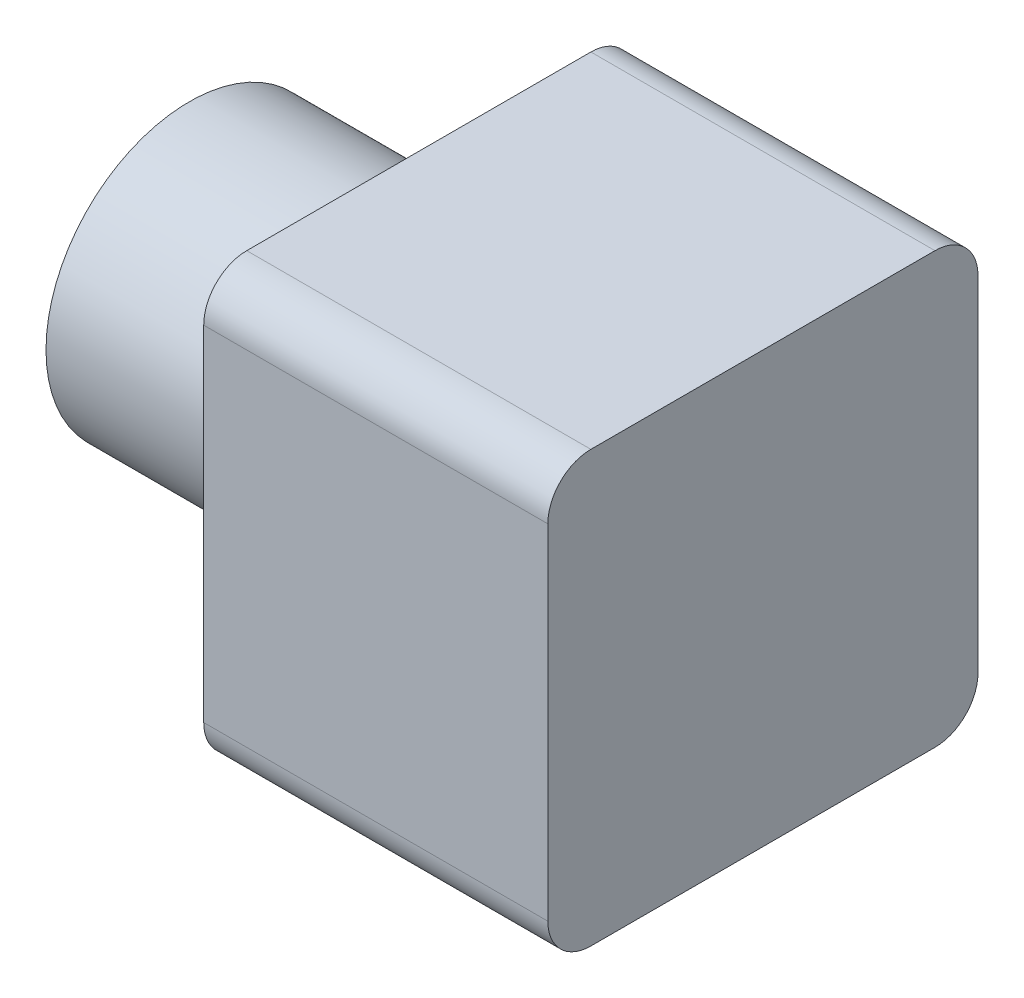
ISO-10303-21;
HEADER;
FILE_DESCRIPTION(('STEP AP214'),'2;1');
FILE_NAME('part.step','',(''),(''),'','','');
FILE_SCHEMA(('AUTOMOTIVE_DESIGN { 1 0 10303 214 1 1 1 1 }'));
ENDSEC;
DATA;
#1=APPLICATION_CONTEXT('core data for automotive mechanical design processes');
#2=APPLICATION_PROTOCOL_DEFINITION('international standard','automotive_design',2000,#1);
#3=PRODUCT_CONTEXT('',#1,'mechanical');
#4=PRODUCT('Part','Part','',(#3));
#5=PRODUCT_RELATED_PRODUCT_CATEGORY('part','',(#4));
#6=PRODUCT_DEFINITION_FORMATION('','',#4);
#7=PRODUCT_DEFINITION_CONTEXT('part definition',#1,'design');
#8=PRODUCT_DEFINITION('design','',#6,#7);
#9=PRODUCT_DEFINITION_SHAPE('','',#8);
#10=(LENGTH_UNIT() NAMED_UNIT(*) SI_UNIT(.MILLI.,.METRE.));
#11=(NAMED_UNIT(*) PLANE_ANGLE_UNIT() SI_UNIT($,.RADIAN.));
#12=(NAMED_UNIT(*) SI_UNIT($,.STERADIAN.) SOLID_ANGLE_UNIT());
#13=UNCERTAINTY_MEASURE_WITH_UNIT(LENGTH_MEASURE(1.E-05),#10,'distance_accuracy_value','');
#14=(GEOMETRIC_REPRESENTATION_CONTEXT(3) GLOBAL_UNCERTAINTY_ASSIGNED_CONTEXT((#13)) GLOBAL_UNIT_ASSIGNED_CONTEXT((#10,
#11,#12)) REPRESENTATION_CONTEXT('',''));
#15=CARTESIAN_POINT('',(0.,0.,0.));
#16=DIRECTION('',(0.,0.,1.));
#17=DIRECTION('',(1.,0.,0.));
#18=AXIS2_PLACEMENT_3D('',#15,#16,#17);
#19=CARTESIAN_POINT('',(-44.1378295770701,-31.6005777705285,-25.0000000000001));
#20=DIRECTION('',(1.,0.,0.));
#21=DIRECTION('',(0.,0.,-1.));
#22=AXIS2_PLACEMENT_3D('',#19,#20,#21);
#23=CYLINDRICAL_SURFACE('',#22,5.);
#24=CARTESIAN_POINT('',(-44.1378295770701,-31.6005777705285,-25.0000000000001));
#25=DIRECTION('',(-1.,0.,0.));
#26=DIRECTION('',(0.,0.,1.));
#27=AXIS2_PLACEMENT_3D('',#24,#25,#26);
#28=CIRCLE('',#27,5.);
#29=CARTESIAN_POINT('',(-44.1378295770701,-31.6005777705285,-20.0000000000001));
#30=VERTEX_POINT('',#29);
#31=EDGE_CURVE('E136',#30,#30,#28,.T.);
#32=ORIENTED_EDGE('',*,*,#31,.F.);
#33=EDGE_LOOP('',(#32));
#34=FACE_BOUND('',#33,.T.);
#35=CARTESIAN_POINT('',(-36.1378295770701,-31.6005777705285,-25.0000000000001));
#36=DIRECTION('',(-1.,0.,0.));
#37=DIRECTION('',(0.,0.,1.));
#38=AXIS2_PLACEMENT_3D('',#35,#36,#37);
#39=CIRCLE('',#38,5.);
#40=CARTESIAN_POINT('',(-36.1378295770701,-31.6005777705285,-20.0000000000001));
#41=VERTEX_POINT('',#40);
#42=EDGE_CURVE('E139',#41,#41,#39,.T.);
#43=ORIENTED_EDGE('',*,*,#42,.T.);
#44=EDGE_LOOP('',(#43));
#45=FACE_BOUND('',#44,.T.);
#46=ADVANCED_FACE('F32',(#34,#45),#23,.T.);
#47=CARTESIAN_POINT('',(-44.1378295770701,-31.6005777705285,-25.0000000000001));
#48=DIRECTION('',(-1.,0.,0.));
#49=DIRECTION('',(0.,0.,1.));
#50=AXIS2_PLACEMENT_3D('',#47,#48,#49);
#51=PLANE('',#50);
#52=CARTESIAN_POINT('',(-44.1378295770701,-31.6005777705285,-25.0000000000001));
#53=DIRECTION('',(-1.,0.,0.));
#54=DIRECTION('',(0.,0.,1.));
#55=AXIS2_PLACEMENT_3D('',#52,#53,#54);
#56=CIRCLE('',#55,3.99999999999999);
#57=CARTESIAN_POINT('',(-44.1378295770701,-31.6005777705285,-21.0000000000001));
#58=VERTEX_POINT('',#57);
#59=EDGE_CURVE('E181',#58,#58,#56,.T.);
#60=ORIENTED_EDGE('',*,*,#59,.F.);
#61=EDGE_LOOP('',(#60));
#62=FACE_BOUND('',#61,.T.);
#63=ORIENTED_EDGE('',*,*,#31,.T.);
#64=EDGE_LOOP('',(#63));
#65=FACE_BOUND('',#64,.T.);
#66=ADVANCED_FACE('F195',(#62,#65),#51,.T.);
#67=CARTESIAN_POINT('',(-24.1378295770701,-24.1005777705285,-17.5));
#68=DIRECTION('',(0.,0.,-1.));
#69=DIRECTION('',(-1.,0.,0.));
#70=AXIS2_PLACEMENT_3D('',#67,#68,#69);
#71=PLANE('',#70);
#72=DIRECTION('',(0.,-1.,0.));
#73=VECTOR('',#72,1.);
#74=CARTESIAN_POINT('',(-36.1378295770701,-24.1005777705285,-17.5000000000001));
#75=LINE('',#74,#73);
#76=CARTESIAN_POINT('',(-36.1378295770701,-25.6005777705285,-17.5000000000001));
#77=VERTEX_POINT('',#76);
#78=CARTESIAN_POINT('',(-36.1378295770701,-37.6005777705285,-17.5000000000001));
#79=VERTEX_POINT('',#78);
#80=EDGE_CURVE('E125',#77,#79,#75,.T.);
#81=ORIENTED_EDGE('',*,*,#80,.T.);
#82=DIRECTION('',(-1.,0.,0.));
#83=VECTOR('',#82,1.);
#84=CARTESIAN_POINT('',(-24.1378295770701,-37.6005777705285,-17.5000000000001));
#85=LINE('',#84,#83);
#86=CARTESIAN_POINT('',(-24.1378295770701,-37.6005777705285,-17.5000000000001));
#87=VERTEX_POINT('',#86);
#88=EDGE_CURVE('E103',#79,#87,#85,.F.);
#89=ORIENTED_EDGE('',*,*,#88,.T.);
#90=DIRECTION('',(0.,-1.,0.));
#91=VECTOR('',#90,1.);
#92=CARTESIAN_POINT('',(-24.1378295770701,-24.1005777705285,-17.5));
#93=LINE('',#92,#91);
#94=CARTESIAN_POINT('',(-24.1378295770701,-25.6005777705285,-17.5));
#95=VERTEX_POINT('',#94);
#96=EDGE_CURVE('E135',#95,#87,#93,.T.);
#97=ORIENTED_EDGE('',*,*,#96,.F.);
#98=DIRECTION('',(-1.,0.,0.));
#99=VECTOR('',#98,1.);
#100=CARTESIAN_POINT('',(-24.1378295770701,-25.6005777705285,-17.5));
#101=LINE('',#100,#99);
#102=EDGE_CURVE('E108',#95,#77,#101,.T.);
#103=ORIENTED_EDGE('',*,*,#102,.T.);
#104=EDGE_LOOP('',(#81,#89,#97,#103));
#105=FACE_BOUND('',#104,.T.);
#106=ADVANCED_FACE('F198',(#105),#71,.F.);
#107=CARTESIAN_POINT('',(-24.1378295770701,-39.1005777705285,-17.5000000000001));
#108=DIRECTION('',(0.,1.,0.));
#109=DIRECTION('',(-1.,0.,0.));
#110=AXIS2_PLACEMENT_3D('',#107,#108,#109);
#111=PLANE('',#110);
#112=DIRECTION('',(0.,0.,-1.));
#113=VECTOR('',#112,1.);
#114=CARTESIAN_POINT('',(-24.1378295770701,-39.1005777705285,-17.5000000000001));
#115=LINE('',#114,#113);
#116=CARTESIAN_POINT('',(-24.1378295770701,-39.1005777705285,-19.0000000000001));
#117=VERTEX_POINT('',#116);
#118=CARTESIAN_POINT('',(-24.1378295770701,-39.1005777705285,-31.0000000000001));
#119=VERTEX_POINT('',#118);
#120=EDGE_CURVE('E118',#117,#119,#115,.T.);
#121=ORIENTED_EDGE('',*,*,#120,.F.);
#122=DIRECTION('',(-1.,0.,0.));
#123=VECTOR('',#122,1.);
#124=CARTESIAN_POINT('',(-24.1378295770701,-39.1005777705285,-19.0000000000001));
#125=LINE('',#124,#123);
#126=CARTESIAN_POINT('',(-36.1378295770701,-39.1005777705285,-19.0000000000001));
#127=VERTEX_POINT('',#126);
#128=EDGE_CURVE('E102',#117,#127,#125,.T.);
#129=ORIENTED_EDGE('',*,*,#128,.T.);
#130=DIRECTION('',(0.,0.,-1.));
#131=VECTOR('',#130,1.);
#132=CARTESIAN_POINT('',(-36.1378295770701,-39.1005777705285,-17.5000000000001));
#133=LINE('',#132,#131);
#134=CARTESIAN_POINT('',(-36.1378295770701,-39.1005777705285,-31.0000000000001));
#135=VERTEX_POINT('',#134);
#136=EDGE_CURVE('E115',#127,#135,#133,.T.);
#137=ORIENTED_EDGE('',*,*,#136,.T.);
#138=DIRECTION('',(-1.,0.,0.));
#139=VECTOR('',#138,1.);
#140=CARTESIAN_POINT('',(-24.1378295770701,-39.1005777705285,-31.0000000000001));
#141=LINE('',#140,#139);
#142=EDGE_CURVE('E120',#135,#119,#141,.F.);
#143=ORIENTED_EDGE('',*,*,#142,.T.);
#144=EDGE_LOOP('',(#121,#129,#137,#143));
#145=FACE_BOUND('',#144,.T.);
#146=ADVANCED_FACE('F114',(#145),#111,.F.);
#147=CARTESIAN_POINT('',(-24.1378295770701,-24.1005777705285,-32.5000000000001));
#148=DIRECTION('',(0.,0.,1.));
#149=DIRECTION('',(1.,0.,0.));
#150=AXIS2_PLACEMENT_3D('',#147,#148,#149);
#151=PLANE('',#150);
#152=DIRECTION('',(0.,1.,0.));
#153=VECTOR('',#152,1.);
#154=CARTESIAN_POINT('',(-24.1378295770701,-24.1005777705285,-32.5000000000001));
#155=LINE('',#154,#153);
#156=CARTESIAN_POINT('',(-24.1378295770701,-37.6005777705285,-32.5000000000001));
#157=VERTEX_POINT('',#156);
#158=CARTESIAN_POINT('',(-24.1378295770701,-25.6005777705285,-32.5000000000001));
#159=VERTEX_POINT('',#158);
#160=EDGE_CURVE('E167',#157,#159,#155,.T.);
#161=ORIENTED_EDGE('',*,*,#160,.F.);
#162=DIRECTION('',(-1.,0.,0.));
#163=VECTOR('',#162,1.);
#164=CARTESIAN_POINT('',(-24.1378295770701,-37.6005777705285,-32.5000000000001));
#165=LINE('',#164,#163);
#166=CARTESIAN_POINT('',(-36.1378295770701,-37.6005777705285,-32.5000000000001));
#167=VERTEX_POINT('',#166);
#168=EDGE_CURVE('E160',#157,#167,#165,.T.);
#169=ORIENTED_EDGE('',*,*,#168,.T.);
#170=DIRECTION('',(0.,1.,0.));
#171=VECTOR('',#170,1.);
#172=CARTESIAN_POINT('',(-36.1378295770701,-24.1005777705285,-32.5000000000001));
#173=LINE('',#172,#171);
#174=CARTESIAN_POINT('',(-36.1378295770701,-25.6005777705285,-32.5000000000001));
#175=VERTEX_POINT('',#174);
#176=EDGE_CURVE('E124',#167,#175,#173,.T.);
#177=ORIENTED_EDGE('',*,*,#176,.T.);
#178=DIRECTION('',(-1.,0.,0.));
#179=VECTOR('',#178,1.);
#180=CARTESIAN_POINT('',(-24.1378295770701,-25.6005777705285,-32.5000000000001));
#181=LINE('',#180,#179);
#182=EDGE_CURVE('E158',#175,#159,#181,.F.);
#183=ORIENTED_EDGE('',*,*,#182,.T.);
#184=EDGE_LOOP('',(#161,#169,#177,#183));
#185=FACE_BOUND('',#184,.T.);
#186=ADVANCED_FACE('F165',(#185),#151,.F.);
#187=CARTESIAN_POINT('',(-24.1378295770701,-24.1005777705285,-17.5));
#188=DIRECTION('',(0.,-1.,0.));
#189=DIRECTION('',(1.,0.,0.));
#190=AXIS2_PLACEMENT_3D('',#187,#188,#189);
#191=PLANE('',#190);
#192=DIRECTION('',(0.,0.,1.));
#193=VECTOR('',#192,1.);
#194=CARTESIAN_POINT('',(-24.1378295770701,-24.1005777705285,-17.5));
#195=LINE('',#194,#193);
#196=CARTESIAN_POINT('',(-24.1378295770701,-24.1005777705285,-31.0000000000001));
#197=VERTEX_POINT('',#196);
#198=CARTESIAN_POINT('',(-24.1378295770701,-24.1005777705285,-19.0000000000001));
#199=VERTEX_POINT('',#198);
#200=EDGE_CURVE('E142',#197,#199,#195,.T.);
#201=ORIENTED_EDGE('',*,*,#200,.F.);
#202=DIRECTION('',(-1.,0.,0.));
#203=VECTOR('',#202,1.);
#204=CARTESIAN_POINT('',(-24.1378295770701,-24.1005777705285,-31.0000000000001));
#205=LINE('',#204,#203);
#206=CARTESIAN_POINT('',(-36.1378295770701,-24.1005777705285,-31.0000000000001));
#207=VERTEX_POINT('',#206);
#208=EDGE_CURVE('E11',#197,#207,#205,.T.);
#209=ORIENTED_EDGE('',*,*,#208,.T.);
#210=DIRECTION('',(0.,0.,1.));
#211=VECTOR('',#210,1.);
#212=CARTESIAN_POINT('',(-36.1378295770701,-24.1005777705285,-17.5000000000001));
#213=LINE('',#212,#211);
#214=CARTESIAN_POINT('',(-36.1378295770701,-24.1005777705285,-19.0000000000001));
#215=VERTEX_POINT('',#214);
#216=EDGE_CURVE('E128',#207,#215,#213,.T.);
#217=ORIENTED_EDGE('',*,*,#216,.T.);
#218=DIRECTION('',(-1.,0.,0.));
#219=VECTOR('',#218,1.);
#220=CARTESIAN_POINT('',(-24.1378295770701,-24.1005777705285,-19.0000000000001));
#221=LINE('',#220,#219);
#222=EDGE_CURVE('E40',#215,#199,#221,.F.);
#223=ORIENTED_EDGE('',*,*,#222,.T.);
#224=EDGE_LOOP('',(#201,#209,#217,#223));
#225=FACE_BOUND('',#224,.T.);
#226=ADVANCED_FACE('F174',(#225),#191,.F.);
#227=CARTESIAN_POINT('',(-24.1378295770701,0.,0.));
#228=DIRECTION('',(1.,0.,0.));
#229=DIRECTION('',(0.,0.,-1.));
#230=AXIS2_PLACEMENT_3D('',#227,#228,#229);
#231=PLANE('',#230);
#232=ORIENTED_EDGE('',*,*,#96,.T.);
#233=CARTESIAN_POINT('',(-24.1378295770701,-37.6005777705285,-19.0000000000001));
#234=DIRECTION('',(1.,0.,0.));
#235=DIRECTION('',(0.,0.,-1.));
#236=AXIS2_PLACEMENT_3D('',#233,#234,#235);
#237=CIRCLE('',#236,1.5);
#238=EDGE_CURVE('E156',#87,#117,#237,.T.);
#239=ORIENTED_EDGE('',*,*,#238,.T.);
#240=ORIENTED_EDGE('',*,*,#120,.T.);
#241=CARTESIAN_POINT('',(-24.1378295770701,-37.6005777705285,-31.0000000000001));
#242=DIRECTION('',(1.,0.,0.));
#243=DIRECTION('',(0.,0.,-1.));
#244=AXIS2_PLACEMENT_3D('',#241,#242,#243);
#245=CIRCLE('',#244,1.5);
#246=EDGE_CURVE('E154',#119,#157,#245,.T.);
#247=ORIENTED_EDGE('',*,*,#246,.T.);
#248=ORIENTED_EDGE('',*,*,#160,.T.);
#249=CARTESIAN_POINT('',(-24.1378295770701,-25.6005777705285,-31.0000000000001));
#250=DIRECTION('',(1.,0.,0.));
#251=DIRECTION('',(0.,0.,-1.));
#252=AXIS2_PLACEMENT_3D('',#249,#250,#251);
#253=CIRCLE('',#252,1.5);
#254=EDGE_CURVE('E53',#159,#197,#253,.T.);
#255=ORIENTED_EDGE('',*,*,#254,.T.);
#256=ORIENTED_EDGE('',*,*,#200,.T.);
#257=CARTESIAN_POINT('',(-24.1378295770701,-25.6005777705285,-19.0000000000001));
#258=DIRECTION('',(1.,0.,0.));
#259=DIRECTION('',(0.,0.,-1.));
#260=AXIS2_PLACEMENT_3D('',#257,#258,#259);
#261=CIRCLE('',#260,1.5);
#262=EDGE_CURVE('E151',#199,#95,#261,.T.);
#263=ORIENTED_EDGE('',*,*,#262,.T.);
#264=EDGE_LOOP('',(#232,#239,#240,#247,#248,#255,#256,#263));
#265=FACE_BOUND('',#264,.T.);
#266=ADVANCED_FACE('F208',(#265),#231,.T.);
#267=CARTESIAN_POINT('',(-36.1378295770701,0.,0.));
#268=DIRECTION('',(1.,0.,0.));
#269=DIRECTION('',(0.,0.,-1.));
#270=AXIS2_PLACEMENT_3D('',#267,#268,#269);
#271=PLANE('',#270);
#272=ORIENTED_EDGE('',*,*,#42,.F.);
#273=EDGE_LOOP('',(#272));
#274=FACE_BOUND('',#273,.T.);
#275=ORIENTED_EDGE('',*,*,#136,.F.);
#276=CARTESIAN_POINT('',(-36.1378295770701,-37.6005777705285,-19.0000000000001));
#277=DIRECTION('',(1.,0.,0.));
#278=DIRECTION('',(0.,0.,-1.));
#279=AXIS2_PLACEMENT_3D('',#276,#277,#278);
#280=CIRCLE('',#279,1.5);
#281=EDGE_CURVE('E98',#127,#79,#280,.F.);
#282=ORIENTED_EDGE('',*,*,#281,.T.);
#283=ORIENTED_EDGE('',*,*,#80,.F.);
#284=CARTESIAN_POINT('',(-36.1378295770701,-25.6005777705285,-19.0000000000001));
#285=DIRECTION('',(1.,0.,0.));
#286=DIRECTION('',(0.,0.,-1.));
#287=AXIS2_PLACEMENT_3D('',#284,#285,#286);
#288=CIRCLE('',#287,1.5);
#289=EDGE_CURVE('E119',#77,#215,#288,.F.);
#290=ORIENTED_EDGE('',*,*,#289,.T.);
#291=ORIENTED_EDGE('',*,*,#216,.F.);
#292=CARTESIAN_POINT('',(-36.1378295770701,-25.6005777705285,-31.0000000000001));
#293=DIRECTION('',(1.,0.,0.));
#294=DIRECTION('',(0.,0.,-1.));
#295=AXIS2_PLACEMENT_3D('',#292,#293,#294);
#296=CIRCLE('',#295,1.5);
#297=EDGE_CURVE('E145',#207,#175,#296,.F.);
#298=ORIENTED_EDGE('',*,*,#297,.T.);
#299=ORIENTED_EDGE('',*,*,#176,.F.);
#300=CARTESIAN_POINT('',(-36.1378295770701,-37.6005777705285,-31.0000000000001));
#301=DIRECTION('',(1.,0.,0.));
#302=DIRECTION('',(0.,0.,-1.));
#303=AXIS2_PLACEMENT_3D('',#300,#301,#302);
#304=CIRCLE('',#303,1.5);
#305=EDGE_CURVE('E109',#167,#135,#304,.F.);
#306=ORIENTED_EDGE('',*,*,#305,.T.);
#307=EDGE_LOOP('',(#275,#282,#283,#290,#291,#298,#299,#306));
#308=FACE_BOUND('',#307,.T.);
#309=ADVANCED_FACE('F122',(#274,#308),#271,.F.);
#310=CARTESIAN_POINT('',(-43.1378295770701,-31.6005777705285,-25.0000000000001));
#311=DIRECTION('',(-1.,0.,0.));
#312=DIRECTION('',(0.,0.,1.));
#313=AXIS2_PLACEMENT_3D('',#310,#311,#312);
#314=CYLINDRICAL_SURFACE('',#313,3.99999999999999);
#315=CARTESIAN_POINT('',(-43.1378295770701,-31.6005777705285,-25.0000000000001));
#316=DIRECTION('',(-1.,0.,0.));
#317=DIRECTION('',(0.,0.,1.));
#318=AXIS2_PLACEMENT_3D('',#315,#316,#317);
#319=CIRCLE('',#318,3.99999999999999);
#320=CARTESIAN_POINT('',(-43.1378295770701,-31.6005777705285,-21.0000000000001));
#321=VERTEX_POINT('',#320);
#322=EDGE_CURVE('E130',#321,#321,#319,.T.);
#323=ORIENTED_EDGE('',*,*,#322,.F.);
#324=EDGE_LOOP('',(#323));
#325=FACE_BOUND('',#324,.T.);
#326=ORIENTED_EDGE('',*,*,#59,.T.);
#327=EDGE_LOOP('',(#326));
#328=FACE_BOUND('',#327,.T.);
#329=ADVANCED_FACE('F189',(#325,#328),#314,.F.);
#330=CARTESIAN_POINT('',(-43.1378295770701,-31.6005777705285,-25.0000000000001));
#331=DIRECTION('',(-1.,0.,0.));
#332=DIRECTION('',(0.,0.,1.));
#333=AXIS2_PLACEMENT_3D('',#330,#331,#332);
#334=PLANE('',#333);
#335=ORIENTED_EDGE('',*,*,#322,.T.);
#336=EDGE_LOOP('',(#335));
#337=FACE_BOUND('',#336,.T.);
#338=ADVANCED_FACE('F187',(#337),#334,.T.);
#339=CARTESIAN_POINT('',(-24.1378295770701,-37.6005777705285,-19.0000000000001));
#340=DIRECTION('',(-1.,0.,0.));
#341=DIRECTION('',(0.,0.,1.));
#342=AXIS2_PLACEMENT_3D('',#339,#340,#341);
#343=CYLINDRICAL_SURFACE('',#342,1.5);
#344=ORIENTED_EDGE('',*,*,#238,.F.);
#345=ORIENTED_EDGE('',*,*,#88,.F.);
#346=ORIENTED_EDGE('',*,*,#281,.F.);
#347=ORIENTED_EDGE('',*,*,#128,.F.);
#348=EDGE_LOOP('',(#344,#345,#346,#347));
#349=FACE_BOUND('',#348,.T.);
#350=ADVANCED_FACE('F101',(#349),#343,.T.);
#351=CARTESIAN_POINT('',(-24.1378295770701,-37.6005777705285,-31.0000000000001));
#352=DIRECTION('',(-1.,0.,0.));
#353=DIRECTION('',(0.,0.,1.));
#354=AXIS2_PLACEMENT_3D('',#351,#352,#353);
#355=CYLINDRICAL_SURFACE('',#354,1.5);
#356=ORIENTED_EDGE('',*,*,#246,.F.);
#357=ORIENTED_EDGE('',*,*,#142,.F.);
#358=ORIENTED_EDGE('',*,*,#305,.F.);
#359=ORIENTED_EDGE('',*,*,#168,.F.);
#360=EDGE_LOOP('',(#356,#357,#358,#359));
#361=FACE_BOUND('',#360,.T.);
#362=ADVANCED_FACE('F226',(#361),#355,.T.);
#363=CARTESIAN_POINT('',(-24.1378295770701,-25.6005777705285,-31.0000000000001));
#364=DIRECTION('',(-1.,0.,0.));
#365=DIRECTION('',(0.,0.,1.));
#366=AXIS2_PLACEMENT_3D('',#363,#364,#365);
#367=CYLINDRICAL_SURFACE('',#366,1.5);
#368=ORIENTED_EDGE('',*,*,#254,.F.);
#369=ORIENTED_EDGE('',*,*,#182,.F.);
#370=ORIENTED_EDGE('',*,*,#297,.F.);
#371=ORIENTED_EDGE('',*,*,#208,.F.);
#372=EDGE_LOOP('',(#368,#369,#370,#371));
#373=FACE_BOUND('',#372,.T.);
#374=ADVANCED_FACE('F173',(#373),#367,.T.);
#375=CARTESIAN_POINT('',(-24.1378295770701,-25.6005777705285,-19.0000000000001));
#376=DIRECTION('',(-1.,0.,0.));
#377=DIRECTION('',(0.,0.,1.));
#378=AXIS2_PLACEMENT_3D('',#375,#376,#377);
#379=CYLINDRICAL_SURFACE('',#378,1.5);
#380=ORIENTED_EDGE('',*,*,#262,.F.);
#381=ORIENTED_EDGE('',*,*,#222,.F.);
#382=ORIENTED_EDGE('',*,*,#289,.F.);
#383=ORIENTED_EDGE('',*,*,#102,.F.);
#384=EDGE_LOOP('',(#380,#381,#382,#383));
#385=FACE_BOUND('',#384,.T.);
#386=ADVANCED_FACE('F34',(#385),#379,.T.);
#387=CLOSED_SHELL('',(#46,#66,#106,#146,#186,#226,#266,#309,#329,#338,#350,#362,#374,#386));
#388=MANIFOLD_SOLID_BREP('B2',#387);
#389=ADVANCED_BREP_SHAPE_REPRESENTATION('',(#18,#388),#14);
#390=SHAPE_DEFINITION_REPRESENTATION(#9,#389);
ENDSEC;
END-ISO-10303-21;
